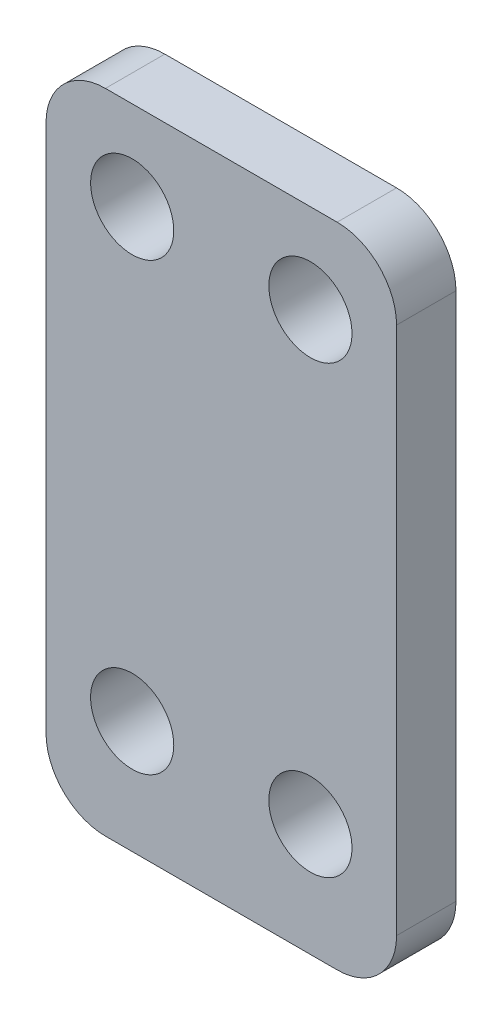
ISO-10303-21;
HEADER;
FILE_DESCRIPTION(('STEP AP214'),'2;1');
FILE_NAME('part.step','',(''),(''),'','','');
FILE_SCHEMA(('AUTOMOTIVE_DESIGN { 1 0 10303 214 1 1 1 1 }'));
ENDSEC;
DATA;
#1=APPLICATION_CONTEXT('core data for automotive mechanical design processes');
#2=APPLICATION_PROTOCOL_DEFINITION('international standard','automotive_design',2000,#1);
#3=PRODUCT_CONTEXT('',#1,'mechanical');
#4=PRODUCT('Part','Part','',(#3));
#5=PRODUCT_RELATED_PRODUCT_CATEGORY('part','',(#4));
#6=PRODUCT_DEFINITION_FORMATION('','',#4);
#7=PRODUCT_DEFINITION_CONTEXT('part definition',#1,'design');
#8=PRODUCT_DEFINITION('design','',#6,#7);
#9=PRODUCT_DEFINITION_SHAPE('','',#8);
#10=(LENGTH_UNIT() NAMED_UNIT(*) SI_UNIT(.MILLI.,.METRE.));
#11=(NAMED_UNIT(*) PLANE_ANGLE_UNIT() SI_UNIT($,.RADIAN.));
#12=(NAMED_UNIT(*) SI_UNIT($,.STERADIAN.) SOLID_ANGLE_UNIT());
#13=UNCERTAINTY_MEASURE_WITH_UNIT(LENGTH_MEASURE(1.E-05),#10,'distance_accuracy_value','');
#14=(GEOMETRIC_REPRESENTATION_CONTEXT(3) GLOBAL_UNCERTAINTY_ASSIGNED_CONTEXT((#13)) GLOBAL_UNIT_ASSIGNED_CONTEXT((#10,
#11,#12)) REPRESENTATION_CONTEXT('',''));
#15=CARTESIAN_POINT('',(0.,0.,0.));
#16=DIRECTION('',(0.,0.,1.));
#17=DIRECTION('',(1.,0.,0.));
#18=AXIS2_PLACEMENT_3D('',#15,#16,#17);
#19=CARTESIAN_POINT('',(0.,0.,2.));
#20=DIRECTION('',(0.,0.,1.));
#21=DIRECTION('',(1.,0.,0.));
#22=AXIS2_PLACEMENT_3D('',#19,#20,#21);
#23=PLANE('',#22);
#24=CARTESIAN_POINT('',(3.,7.9,2.));
#25=DIRECTION('',(0.,0.,1.));
#26=DIRECTION('',(1.,0.,0.));
#27=AXIS2_PLACEMENT_3D('',#24,#25,#26);
#28=CIRCLE('',#27,1.4);
#29=CARTESIAN_POINT('',(4.4,7.9,2.));
#30=VERTEX_POINT('',#29);
#31=EDGE_CURVE('E199',#30,#30,#28,.T.);
#32=ORIENTED_EDGE('',*,*,#31,.F.);
#33=EDGE_LOOP('',(#32));
#34=FACE_BOUND('',#33,.T.);
#35=CARTESIAN_POINT('',(-3.,-7.1,2.));
#36=DIRECTION('',(0.,0.,1.));
#37=DIRECTION('',(1.,0.,0.));
#38=AXIS2_PLACEMENT_3D('',#35,#36,#37);
#39=CIRCLE('',#38,1.4);
#40=CARTESIAN_POINT('',(-1.6,-7.1,2.));
#41=VERTEX_POINT('',#40);
#42=EDGE_CURVE('E137',#41,#41,#39,.T.);
#43=ORIENTED_EDGE('',*,*,#42,.F.);
#44=EDGE_LOOP('',(#43));
#45=FACE_BOUND('',#44,.T.);
#46=DIRECTION('',(1.,0.,0.));
#47=VECTOR('',#46,1.);
#48=CARTESIAN_POINT('',(-5.9,-10.9,2.));
#49=LINE('',#48,#47);
#50=CARTESIAN_POINT('',(-3.9,-10.9,2.));
#51=VERTEX_POINT('',#50);
#52=CARTESIAN_POINT('',(3.9,-10.9,2.));
#53=VERTEX_POINT('',#52);
#54=EDGE_CURVE('E146',#51,#53,#49,.T.);
#55=ORIENTED_EDGE('',*,*,#54,.T.);
#56=CARTESIAN_POINT('',(3.9,-8.9,2.));
#57=DIRECTION('',(0.,0.,1.));
#58=DIRECTION('',(1.,0.,0.));
#59=AXIS2_PLACEMENT_3D('',#56,#57,#58);
#60=CIRCLE('',#59,2.);
#61=CARTESIAN_POINT('',(5.9,-8.9,2.));
#62=VERTEX_POINT('',#61);
#63=EDGE_CURVE('E164',#53,#62,#60,.T.);
#64=ORIENTED_EDGE('',*,*,#63,.T.);
#65=DIRECTION('',(0.,1.,0.));
#66=VECTOR('',#65,1.);
#67=CARTESIAN_POINT('',(5.9,10.9,2.));
#68=LINE('',#67,#66);
#69=CARTESIAN_POINT('',(5.9,8.9,2.));
#70=VERTEX_POINT('',#69);
#71=EDGE_CURVE('E128',#62,#70,#68,.T.);
#72=ORIENTED_EDGE('',*,*,#71,.T.);
#73=CARTESIAN_POINT('',(3.9,8.9,2.));
#74=DIRECTION('',(0.,0.,1.));
#75=DIRECTION('',(1.,0.,0.));
#76=AXIS2_PLACEMENT_3D('',#73,#74,#75);
#77=CIRCLE('',#76,2.);
#78=CARTESIAN_POINT('',(3.9,10.9,2.));
#79=VERTEX_POINT('',#78);
#80=EDGE_CURVE('E160',#70,#79,#77,.T.);
#81=ORIENTED_EDGE('',*,*,#80,.T.);
#82=DIRECTION('',(-1.,0.,0.));
#83=VECTOR('',#82,1.);
#84=CARTESIAN_POINT('',(-5.9,10.9,2.));
#85=LINE('',#84,#83);
#86=CARTESIAN_POINT('',(-3.9,10.9,2.));
#87=VERTEX_POINT('',#86);
#88=EDGE_CURVE('E173',#79,#87,#85,.T.);
#89=ORIENTED_EDGE('',*,*,#88,.T.);
#90=CARTESIAN_POINT('',(-3.9,8.9,2.));
#91=DIRECTION('',(0.,0.,1.));
#92=DIRECTION('',(1.,0.,0.));
#93=AXIS2_PLACEMENT_3D('',#90,#91,#92);
#94=CIRCLE('',#93,2.);
#95=CARTESIAN_POINT('',(-5.9,8.9,2.));
#96=VERTEX_POINT('',#95);
#97=EDGE_CURVE('E63',#87,#96,#94,.T.);
#98=ORIENTED_EDGE('',*,*,#97,.T.);
#99=DIRECTION('',(0.,-1.,0.));
#100=VECTOR('',#99,1.);
#101=CARTESIAN_POINT('',(-5.9,10.9,2.));
#102=LINE('',#101,#100);
#103=CARTESIAN_POINT('',(-5.9,-8.9,2.));
#104=VERTEX_POINT('',#103);
#105=EDGE_CURVE('E179',#96,#104,#102,.T.);
#106=ORIENTED_EDGE('',*,*,#105,.T.);
#107=CARTESIAN_POINT('',(-3.9,-8.9,2.));
#108=DIRECTION('',(0.,0.,1.));
#109=DIRECTION('',(1.,0.,0.));
#110=AXIS2_PLACEMENT_3D('',#107,#108,#109);
#111=CIRCLE('',#110,2.);
#112=EDGE_CURVE('E162',#104,#51,#111,.T.);
#113=ORIENTED_EDGE('',*,*,#112,.T.);
#114=EDGE_LOOP('',(#55,#64,#72,#81,#89,#98,#106,#113));
#115=FACE_BOUND('',#114,.T.);
#116=CARTESIAN_POINT('',(-3.,7.9,2.));
#117=DIRECTION('',(0.,0.,1.));
#118=DIRECTION('',(-1.,0.,0.));
#119=AXIS2_PLACEMENT_3D('',#116,#117,#118);
#120=CIRCLE('',#119,1.4);
#121=CARTESIAN_POINT('',(-4.4,7.9,2.));
#122=VERTEX_POINT('',#121);
#123=EDGE_CURVE('E194',#122,#122,#120,.T.);
#124=ORIENTED_EDGE('',*,*,#123,.F.);
#125=EDGE_LOOP('',(#124));
#126=FACE_BOUND('',#125,.T.);
#127=CARTESIAN_POINT('',(3.,-7.1,2.));
#128=DIRECTION('',(0.,0.,1.));
#129=DIRECTION('',(-1.,0.,0.));
#130=AXIS2_PLACEMENT_3D('',#127,#128,#129);
#131=CIRCLE('',#130,1.4);
#132=CARTESIAN_POINT('',(1.6,-7.1,2.));
#133=VERTEX_POINT('',#132);
#134=EDGE_CURVE('E205',#133,#133,#131,.T.);
#135=ORIENTED_EDGE('',*,*,#134,.F.);
#136=EDGE_LOOP('',(#135));
#137=FACE_BOUND('',#136,.T.);
#138=ADVANCED_FACE('F41',(#34,#45,#115,#126,#137),#23,.T.);
#139=CARTESIAN_POINT('',(0.,0.,0.));
#140=DIRECTION('',(0.,0.,1.));
#141=DIRECTION('',(1.,0.,0.));
#142=AXIS2_PLACEMENT_3D('',#139,#140,#141);
#143=PLANE('',#142);
#144=DIRECTION('',(0.,1.,0.));
#145=VECTOR('',#144,1.);
#146=CARTESIAN_POINT('',(5.9,10.9,0.));
#147=LINE('',#146,#145);
#148=CARTESIAN_POINT('',(5.9,-8.9,0.));
#149=VERTEX_POINT('',#148);
#150=CARTESIAN_POINT('',(5.9,8.9,0.));
#151=VERTEX_POINT('',#150);
#152=EDGE_CURVE('E125',#149,#151,#147,.T.);
#153=ORIENTED_EDGE('',*,*,#152,.F.);
#154=CARTESIAN_POINT('',(3.9,-8.9,0.));
#155=DIRECTION('',(0.,0.,1.));
#156=DIRECTION('',(1.,0.,0.));
#157=AXIS2_PLACEMENT_3D('',#154,#155,#156);
#158=CIRCLE('',#157,2.);
#159=CARTESIAN_POINT('',(3.9,-10.9,0.));
#160=VERTEX_POINT('',#159);
#161=EDGE_CURVE('E108',#149,#160,#158,.F.);
#162=ORIENTED_EDGE('',*,*,#161,.T.);
#163=DIRECTION('',(1.,0.,0.));
#164=VECTOR('',#163,1.);
#165=CARTESIAN_POINT('',(-5.9,-10.9,0.));
#166=LINE('',#165,#164);
#167=CARTESIAN_POINT('',(-3.9,-10.9,0.));
#168=VERTEX_POINT('',#167);
#169=EDGE_CURVE('E150',#168,#160,#166,.T.);
#170=ORIENTED_EDGE('',*,*,#169,.F.);
#171=CARTESIAN_POINT('',(-3.9,-8.9,0.));
#172=DIRECTION('',(0.,0.,1.));
#173=DIRECTION('',(1.,0.,0.));
#174=AXIS2_PLACEMENT_3D('',#171,#172,#173);
#175=CIRCLE('',#174,2.);
#176=CARTESIAN_POINT('',(-5.9,-8.9,0.));
#177=VERTEX_POINT('',#176);
#178=EDGE_CURVE('E119',#168,#177,#175,.F.);
#179=ORIENTED_EDGE('',*,*,#178,.T.);
#180=DIRECTION('',(0.,-1.,0.));
#181=VECTOR('',#180,1.);
#182=CARTESIAN_POINT('',(-5.9,10.9,0.));
#183=LINE('',#182,#181);
#184=CARTESIAN_POINT('',(-5.9,8.9,0.));
#185=VERTEX_POINT('',#184);
#186=EDGE_CURVE('E140',#185,#177,#183,.T.);
#187=ORIENTED_EDGE('',*,*,#186,.F.);
#188=CARTESIAN_POINT('',(-3.9,8.9,0.));
#189=DIRECTION('',(0.,0.,1.));
#190=DIRECTION('',(1.,0.,0.));
#191=AXIS2_PLACEMENT_3D('',#188,#189,#190);
#192=CIRCLE('',#191,2.);
#193=CARTESIAN_POINT('',(-3.9,10.9,0.));
#194=VERTEX_POINT('',#193);
#195=EDGE_CURVE('E129',#185,#194,#192,.F.);
#196=ORIENTED_EDGE('',*,*,#195,.T.);
#197=DIRECTION('',(-1.,0.,0.));
#198=VECTOR('',#197,1.);
#199=CARTESIAN_POINT('',(-5.9,10.9,0.));
#200=LINE('',#199,#198);
#201=CARTESIAN_POINT('',(3.9,10.9,0.));
#202=VERTEX_POINT('',#201);
#203=EDGE_CURVE('E136',#202,#194,#200,.T.);
#204=ORIENTED_EDGE('',*,*,#203,.F.);
#205=CARTESIAN_POINT('',(3.9,8.9,0.));
#206=DIRECTION('',(0.,0.,1.));
#207=DIRECTION('',(1.,0.,0.));
#208=AXIS2_PLACEMENT_3D('',#205,#206,#207);
#209=CIRCLE('',#208,2.);
#210=EDGE_CURVE('E135',#202,#151,#209,.F.);
#211=ORIENTED_EDGE('',*,*,#210,.T.);
#212=EDGE_LOOP('',(#153,#162,#170,#179,#187,#196,#204,#211));
#213=FACE_BOUND('',#212,.T.);
#214=CARTESIAN_POINT('',(-3.,-7.1,0.));
#215=DIRECTION('',(0.,0.,1.));
#216=DIRECTION('',(1.,0.,0.));
#217=AXIS2_PLACEMENT_3D('',#214,#215,#216);
#218=CIRCLE('',#217,1.4);
#219=CARTESIAN_POINT('',(-1.6,-7.1,0.));
#220=VERTEX_POINT('',#219);
#221=EDGE_CURVE('E143',#220,#220,#218,.T.);
#222=ORIENTED_EDGE('',*,*,#221,.T.);
#223=EDGE_LOOP('',(#222));
#224=FACE_BOUND('',#223,.T.);
#225=CARTESIAN_POINT('',(-3.,7.9,0.));
#226=DIRECTION('',(0.,0.,1.));
#227=DIRECTION('',(-1.,0.,0.));
#228=AXIS2_PLACEMENT_3D('',#225,#226,#227);
#229=CIRCLE('',#228,1.4);
#230=CARTESIAN_POINT('',(-4.4,7.9,0.));
#231=VERTEX_POINT('',#230);
#232=EDGE_CURVE('E196',#231,#231,#229,.T.);
#233=ORIENTED_EDGE('',*,*,#232,.T.);
#234=EDGE_LOOP('',(#233));
#235=FACE_BOUND('',#234,.T.);
#236=CARTESIAN_POINT('',(3.,7.9,0.));
#237=DIRECTION('',(0.,0.,1.));
#238=DIRECTION('',(1.,0.,0.));
#239=AXIS2_PLACEMENT_3D('',#236,#237,#238);
#240=CIRCLE('',#239,1.4);
#241=CARTESIAN_POINT('',(4.4,7.9,0.));
#242=VERTEX_POINT('',#241);
#243=EDGE_CURVE('E202',#242,#242,#240,.T.);
#244=ORIENTED_EDGE('',*,*,#243,.T.);
#245=EDGE_LOOP('',(#244));
#246=FACE_BOUND('',#245,.T.);
#247=CARTESIAN_POINT('',(3.,-7.1,0.));
#248=DIRECTION('',(0.,0.,1.));
#249=DIRECTION('',(-1.,0.,0.));
#250=AXIS2_PLACEMENT_3D('',#247,#248,#249);
#251=CIRCLE('',#250,1.4);
#252=CARTESIAN_POINT('',(1.6,-7.1,0.));
#253=VERTEX_POINT('',#252);
#254=EDGE_CURVE('E208',#253,#253,#251,.T.);
#255=ORIENTED_EDGE('',*,*,#254,.T.);
#256=EDGE_LOOP('',(#255));
#257=FACE_BOUND('',#256,.T.);
#258=ADVANCED_FACE('F132',(#213,#224,#235,#246,#257),#143,.F.);
#259=CARTESIAN_POINT('',(5.9,10.9,2.));
#260=DIRECTION('',(-1.,0.,0.));
#261=DIRECTION('',(0.,-1.,0.));
#262=AXIS2_PLACEMENT_3D('',#259,#260,#261);
#263=PLANE('',#262);
#264=ORIENTED_EDGE('',*,*,#71,.F.);
#265=DIRECTION('',(0.,0.,-1.));
#266=VECTOR('',#265,1.);
#267=CARTESIAN_POINT('',(5.9,-8.9,2.));
#268=LINE('',#267,#266);
#269=EDGE_CURVE('E112',#62,#149,#268,.T.);
#270=ORIENTED_EDGE('',*,*,#269,.T.);
#271=ORIENTED_EDGE('',*,*,#152,.T.);
#272=DIRECTION('',(0.,0.,-1.));
#273=VECTOR('',#272,1.);
#274=CARTESIAN_POINT('',(5.9,8.9,2.));
#275=LINE('',#274,#273);
#276=EDGE_CURVE('E130',#151,#70,#275,.F.);
#277=ORIENTED_EDGE('',*,*,#276,.T.);
#278=EDGE_LOOP('',(#264,#270,#271,#277));
#279=FACE_BOUND('',#278,.T.);
#280=ADVANCED_FACE('F124',(#279),#263,.F.);
#281=CARTESIAN_POINT('',(-5.9,10.9,2.));
#282=DIRECTION('',(0.,-1.,0.));
#283=DIRECTION('',(0.,0.,-1.));
#284=AXIS2_PLACEMENT_3D('',#281,#282,#283);
#285=PLANE('',#284);
#286=ORIENTED_EDGE('',*,*,#88,.F.);
#287=DIRECTION('',(0.,0.,-1.));
#288=VECTOR('',#287,1.);
#289=CARTESIAN_POINT('',(3.9,10.9,2.));
#290=LINE('',#289,#288);
#291=EDGE_CURVE('E11',#79,#202,#290,.T.);
#292=ORIENTED_EDGE('',*,*,#291,.T.);
#293=ORIENTED_EDGE('',*,*,#203,.T.);
#294=DIRECTION('',(0.,0.,-1.));
#295=VECTOR('',#294,1.);
#296=CARTESIAN_POINT('',(-3.9,10.9,2.));
#297=LINE('',#296,#295);
#298=EDGE_CURVE('E49',#194,#87,#297,.F.);
#299=ORIENTED_EDGE('',*,*,#298,.T.);
#300=EDGE_LOOP('',(#286,#292,#293,#299));
#301=FACE_BOUND('',#300,.T.);
#302=ADVANCED_FACE('F172',(#301),#285,.F.);
#303=CARTESIAN_POINT('',(-5.9,10.9,2.));
#304=DIRECTION('',(1.,0.,0.));
#305=DIRECTION('',(0.,1.,0.));
#306=AXIS2_PLACEMENT_3D('',#303,#304,#305);
#307=PLANE('',#306);
#308=ORIENTED_EDGE('',*,*,#186,.T.);
#309=DIRECTION('',(0.,0.,-1.));
#310=VECTOR('',#309,1.);
#311=CARTESIAN_POINT('',(-5.9,-8.9,2.));
#312=LINE('',#311,#310);
#313=EDGE_CURVE('E56',#177,#104,#312,.F.);
#314=ORIENTED_EDGE('',*,*,#313,.T.);
#315=ORIENTED_EDGE('',*,*,#105,.F.);
#316=DIRECTION('',(0.,0.,-1.));
#317=VECTOR('',#316,1.);
#318=CARTESIAN_POINT('',(-5.9,8.9,2.));
#319=LINE('',#318,#317);
#320=EDGE_CURVE('E166',#96,#185,#319,.T.);
#321=ORIENTED_EDGE('',*,*,#320,.T.);
#322=EDGE_LOOP('',(#308,#314,#315,#321));
#323=FACE_BOUND('',#322,.T.);
#324=ADVANCED_FACE('F183',(#323),#307,.F.);
#325=CARTESIAN_POINT('',(-5.9,-10.9,2.));
#326=DIRECTION('',(0.,1.,0.));
#327=DIRECTION('',(0.,0.,1.));
#328=AXIS2_PLACEMENT_3D('',#325,#326,#327);
#329=PLANE('',#328);
#330=ORIENTED_EDGE('',*,*,#169,.T.);
#331=DIRECTION('',(0.,0.,-1.));
#332=VECTOR('',#331,1.);
#333=CARTESIAN_POINT('',(3.9,-10.9,2.));
#334=LINE('',#333,#332);
#335=EDGE_CURVE('E113',#160,#53,#334,.F.);
#336=ORIENTED_EDGE('',*,*,#335,.T.);
#337=ORIENTED_EDGE('',*,*,#54,.F.);
#338=DIRECTION('',(0.,0.,-1.));
#339=VECTOR('',#338,1.);
#340=CARTESIAN_POINT('',(-3.9,-10.9,2.));
#341=LINE('',#340,#339);
#342=EDGE_CURVE('E118',#51,#168,#341,.T.);
#343=ORIENTED_EDGE('',*,*,#342,.T.);
#344=EDGE_LOOP('',(#330,#336,#337,#343));
#345=FACE_BOUND('',#344,.T.);
#346=ADVANCED_FACE('F190',(#345),#329,.F.);
#347=CARTESIAN_POINT('',(-3.,-7.1,2.));
#348=DIRECTION('',(0.,0.,-1.));
#349=DIRECTION('',(-1.,0.,0.));
#350=AXIS2_PLACEMENT_3D('',#347,#348,#349);
#351=CYLINDRICAL_SURFACE('',#350,1.4);
#352=ORIENTED_EDGE('',*,*,#42,.T.);
#353=EDGE_LOOP('',(#352));
#354=FACE_BOUND('',#353,.T.);
#355=ORIENTED_EDGE('',*,*,#221,.F.);
#356=EDGE_LOOP('',(#355));
#357=FACE_BOUND('',#356,.T.);
#358=ADVANCED_FACE('F228',(#354,#357),#351,.F.);
#359=CARTESIAN_POINT('',(-3.,7.9,2.));
#360=DIRECTION('',(0.,0.,-1.));
#361=DIRECTION('',(-1.,0.,0.));
#362=AXIS2_PLACEMENT_3D('',#359,#360,#361);
#363=CYLINDRICAL_SURFACE('',#362,1.4);
#364=ORIENTED_EDGE('',*,*,#123,.T.);
#365=EDGE_LOOP('',(#364));
#366=FACE_BOUND('',#365,.T.);
#367=ORIENTED_EDGE('',*,*,#232,.F.);
#368=EDGE_LOOP('',(#367));
#369=FACE_BOUND('',#368,.T.);
#370=ADVANCED_FACE('F284',(#366,#369),#363,.F.);
#371=CARTESIAN_POINT('',(3.,7.9,2.));
#372=DIRECTION('',(0.,0.,-1.));
#373=DIRECTION('',(-1.,0.,0.));
#374=AXIS2_PLACEMENT_3D('',#371,#372,#373);
#375=CYLINDRICAL_SURFACE('',#374,1.4);
#376=ORIENTED_EDGE('',*,*,#31,.T.);
#377=EDGE_LOOP('',(#376));
#378=FACE_BOUND('',#377,.T.);
#379=ORIENTED_EDGE('',*,*,#243,.F.);
#380=EDGE_LOOP('',(#379));
#381=FACE_BOUND('',#380,.T.);
#382=ADVANCED_FACE('F275',(#378,#381),#375,.F.);
#383=CARTESIAN_POINT('',(3.,-7.1,2.));
#384=DIRECTION('',(0.,0.,-1.));
#385=DIRECTION('',(-1.,0.,0.));
#386=AXIS2_PLACEMENT_3D('',#383,#384,#385);
#387=CYLINDRICAL_SURFACE('',#386,1.4);
#388=ORIENTED_EDGE('',*,*,#134,.T.);
#389=EDGE_LOOP('',(#388));
#390=FACE_BOUND('',#389,.T.);
#391=ORIENTED_EDGE('',*,*,#254,.F.);
#392=EDGE_LOOP('',(#391));
#393=FACE_BOUND('',#392,.T.);
#394=ADVANCED_FACE('F214',(#390,#393),#387,.F.);
#395=CARTESIAN_POINT('',(3.9,-8.9,2.));
#396=DIRECTION('',(0.,0.,-1.));
#397=DIRECTION('',(-1.,0.,0.));
#398=AXIS2_PLACEMENT_3D('',#395,#396,#397);
#399=CYLINDRICAL_SURFACE('',#398,2.);
#400=ORIENTED_EDGE('',*,*,#63,.F.);
#401=ORIENTED_EDGE('',*,*,#335,.F.);
#402=ORIENTED_EDGE('',*,*,#161,.F.);
#403=ORIENTED_EDGE('',*,*,#269,.F.);
#404=EDGE_LOOP('',(#400,#401,#402,#403));
#405=FACE_BOUND('',#404,.T.);
#406=ADVANCED_FACE('F111',(#405),#399,.T.);
#407=CARTESIAN_POINT('',(-3.9,-8.9,2.));
#408=DIRECTION('',(0.,0.,-1.));
#409=DIRECTION('',(-1.,0.,0.));
#410=AXIS2_PLACEMENT_3D('',#407,#408,#409);
#411=CYLINDRICAL_SURFACE('',#410,2.);
#412=ORIENTED_EDGE('',*,*,#112,.F.);
#413=ORIENTED_EDGE('',*,*,#313,.F.);
#414=ORIENTED_EDGE('',*,*,#178,.F.);
#415=ORIENTED_EDGE('',*,*,#342,.F.);
#416=EDGE_LOOP('',(#412,#413,#414,#415));
#417=FACE_BOUND('',#416,.T.);
#418=ADVANCED_FACE('F187',(#417),#411,.T.);
#419=CARTESIAN_POINT('',(3.9,8.9,2.));
#420=DIRECTION('',(0.,0.,-1.));
#421=DIRECTION('',(-1.,0.,0.));
#422=AXIS2_PLACEMENT_3D('',#419,#420,#421);
#423=CYLINDRICAL_SURFACE('',#422,2.);
#424=ORIENTED_EDGE('',*,*,#80,.F.);
#425=ORIENTED_EDGE('',*,*,#276,.F.);
#426=ORIENTED_EDGE('',*,*,#210,.F.);
#427=ORIENTED_EDGE('',*,*,#291,.F.);
#428=EDGE_LOOP('',(#424,#425,#426,#427));
#429=FACE_BOUND('',#428,.T.);
#430=ADVANCED_FACE('F242',(#429),#423,.T.);
#431=CARTESIAN_POINT('',(-3.9,8.9,2.));
#432=DIRECTION('',(0.,0.,-1.));
#433=DIRECTION('',(-1.,0.,0.));
#434=AXIS2_PLACEMENT_3D('',#431,#432,#433);
#435=CYLINDRICAL_SURFACE('',#434,2.);
#436=ORIENTED_EDGE('',*,*,#97,.F.);
#437=ORIENTED_EDGE('',*,*,#298,.F.);
#438=ORIENTED_EDGE('',*,*,#195,.F.);
#439=ORIENTED_EDGE('',*,*,#320,.F.);
#440=EDGE_LOOP('',(#436,#437,#438,#439));
#441=FACE_BOUND('',#440,.T.);
#442=ADVANCED_FACE('F43',(#441),#435,.T.);
#443=CLOSED_SHELL('',(#138,#258,#280,#302,#324,#346,#358,#370,#382,#394,#406,#418,#430,#442));
#444=MANIFOLD_SOLID_BREP('B2',#443);
#445=ADVANCED_BREP_SHAPE_REPRESENTATION('',(#18,#444),#14);
#446=SHAPE_DEFINITION_REPRESENTATION(#9,#445);
ENDSEC;
END-ISO-10303-21;
